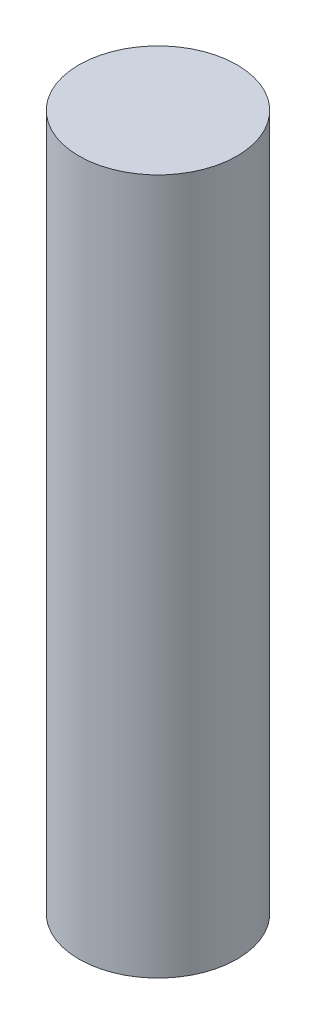
ISO-10303-21;
HEADER;
FILE_DESCRIPTION(('STEP AP214'),'2;1');
FILE_NAME('part.step','',(''),(''),'','','');
FILE_SCHEMA(('AUTOMOTIVE_DESIGN { 1 0 10303 214 1 1 1 1 }'));
ENDSEC;
DATA;
#1=APPLICATION_CONTEXT('core data for automotive mechanical design processes');
#2=APPLICATION_PROTOCOL_DEFINITION('international standard','automotive_design',2000,#1);
#3=PRODUCT_CONTEXT('',#1,'mechanical');
#4=PRODUCT('Part','Part','',(#3));
#5=PRODUCT_RELATED_PRODUCT_CATEGORY('part','',(#4));
#6=PRODUCT_DEFINITION_FORMATION('','',#4);
#7=PRODUCT_DEFINITION_CONTEXT('part definition',#1,'design');
#8=PRODUCT_DEFINITION('design','',#6,#7);
#9=PRODUCT_DEFINITION_SHAPE('','',#8);
#10=(LENGTH_UNIT() NAMED_UNIT(*) SI_UNIT(.MILLI.,.METRE.));
#11=(NAMED_UNIT(*) PLANE_ANGLE_UNIT() SI_UNIT($,.RADIAN.));
#12=(NAMED_UNIT(*) SI_UNIT($,.STERADIAN.) SOLID_ANGLE_UNIT());
#13=UNCERTAINTY_MEASURE_WITH_UNIT(LENGTH_MEASURE(1.E-05),#10,'distance_accuracy_value','');
#14=(GEOMETRIC_REPRESENTATION_CONTEXT(3) GLOBAL_UNCERTAINTY_ASSIGNED_CONTEXT((#13)) GLOBAL_UNIT_ASSIGNED_CONTEXT((#10,
#11,#12)) REPRESENTATION_CONTEXT('',''));
#15=CARTESIAN_POINT('',(0.,0.,0.));
#16=DIRECTION('',(0.,0.,1.));
#17=DIRECTION('',(1.,0.,0.));
#18=AXIS2_PLACEMENT_3D('',#15,#16,#17);
#19=CARTESIAN_POINT('',(0.,34.925,0.));
#20=DIRECTION('',(0.,-1.,0.));
#21=DIRECTION('',(0.,0.,-1.));
#22=AXIS2_PLACEMENT_3D('',#19,#20,#21);
#23=CYLINDRICAL_SURFACE('',#22,3.96875);
#24=CARTESIAN_POINT('',(0.,34.925,0.));
#25=DIRECTION('',(0.,1.,0.));
#26=DIRECTION('',(0.,0.,1.));
#27=AXIS2_PLACEMENT_3D('',#24,#25,#26);
#28=CIRCLE('',#27,3.96875);
#29=CARTESIAN_POINT('',(0.,34.925,3.96875));
#30=VERTEX_POINT('',#29);
#31=EDGE_CURVE('E11',#30,#30,#28,.T.);
#32=ORIENTED_EDGE('',*,*,#31,.F.);
#33=EDGE_LOOP('',(#32));
#34=FACE_BOUND('',#33,.T.);
#35=CARTESIAN_POINT('',(0.,0.,0.));
#36=DIRECTION('',(0.,1.,0.));
#37=DIRECTION('',(0.,0.,1.));
#38=AXIS2_PLACEMENT_3D('',#35,#36,#37);
#39=CIRCLE('',#38,3.96875);
#40=CARTESIAN_POINT('',(0.,0.,3.96875));
#41=VERTEX_POINT('',#40);
#42=EDGE_CURVE('E40',#41,#41,#39,.T.);
#43=ORIENTED_EDGE('',*,*,#42,.T.);
#44=EDGE_LOOP('',(#43));
#45=FACE_BOUND('',#44,.T.);
#46=ADVANCED_FACE('F37',(#34,#45),#23,.T.);
#47=CARTESIAN_POINT('',(0.,34.925,0.));
#48=DIRECTION('',(0.,1.,0.));
#49=DIRECTION('',(0.,0.,1.));
#50=AXIS2_PLACEMENT_3D('',#47,#48,#49);
#51=PLANE('',#50);
#52=ORIENTED_EDGE('',*,*,#31,.T.);
#53=EDGE_LOOP('',(#52));
#54=FACE_BOUND('',#53,.T.);
#55=ADVANCED_FACE('F66',(#54),#51,.T.);
#56=CARTESIAN_POINT('',(0.,0.,0.));
#57=DIRECTION('',(0.,1.,0.));
#58=DIRECTION('',(0.,0.,1.));
#59=AXIS2_PLACEMENT_3D('',#56,#57,#58);
#60=PLANE('',#59);
#61=CARTESIAN_POINT('',(0.,0.,0.));
#62=DIRECTION('',(0.,-1.,0.));
#63=DIRECTION('',(0.,0.,-1.));
#64=AXIS2_PLACEMENT_3D('',#61,#62,#63);
#65=CIRCLE('',#64,2.01929999999999);
#66=CARTESIAN_POINT('',(0.,0.,-2.01929999999999));
#67=VERTEX_POINT('',#66);
#68=EDGE_CURVE('E56',#67,#67,#65,.T.);
#69=ORIENTED_EDGE('',*,*,#68,.F.);
#70=EDGE_LOOP('',(#69));
#71=FACE_BOUND('',#70,.T.);
#72=ORIENTED_EDGE('',*,*,#42,.F.);
#73=EDGE_LOOP('',(#72));
#74=FACE_BOUND('',#73,.T.);
#75=ADVANCED_FACE('F50',(#71,#74),#60,.F.);
#76=CARTESIAN_POINT('',(0.,7.62,0.));
#77=DIRECTION('',(0.,-1.,0.));
#78=DIRECTION('',(0.,0.,-1.));
#79=AXIS2_PLACEMENT_3D('',#76,#77,#78);
#80=CONICAL_SURFACE('',#79,2.0193,1.02974425867665);
#81=CARTESIAN_POINT('',(0.,8.83331784800235,0.));
#82=VERTEX_POINT('',#81);
#83=VERTEX_LOOP('',#82);
#84=FACE_BOUND('',#83,.T.);
#85=CARTESIAN_POINT('',(0.,7.62,0.));
#86=DIRECTION('',(0.,-1.,0.));
#87=DIRECTION('',(0.,0.,-1.));
#88=AXIS2_PLACEMENT_3D('',#85,#86,#87);
#89=CIRCLE('',#88,2.0193);
#90=CARTESIAN_POINT('',(0.,7.62,-2.0193));
#91=VERTEX_POINT('',#90);
#92=EDGE_CURVE('E54',#91,#91,#89,.T.);
#93=ORIENTED_EDGE('',*,*,#92,.T.);
#94=EDGE_LOOP('',(#93));
#95=FACE_BOUND('',#94,.T.);
#96=ADVANCED_FACE('F46',(#84,#95),#80,.F.);
#97=CARTESIAN_POINT('',(0.,0.,0.));
#98=DIRECTION('',(0.,-1.,0.));
#99=DIRECTION('',(0.,0.,-1.));
#100=AXIS2_PLACEMENT_3D('',#97,#98,#99);
#101=CYLINDRICAL_SURFACE('',#100,2.01929999999999);
#102=ORIENTED_EDGE('',*,*,#92,.F.);
#103=EDGE_LOOP('',(#102));
#104=FACE_BOUND('',#103,.T.);
#105=ORIENTED_EDGE('',*,*,#68,.T.);
#106=EDGE_LOOP('',(#105));
#107=FACE_BOUND('',#106,.T.);
#108=ADVANCED_FACE('F49',(#104,#107),#101,.F.);
#109=CLOSED_SHELL('',(#46,#55,#75,#96,#108));
#110=MANIFOLD_SOLID_BREP('B2',#109);
#111=ADVANCED_BREP_SHAPE_REPRESENTATION('',(#18,#110),#14);
#112=SHAPE_DEFINITION_REPRESENTATION(#9,#111);
ENDSEC;
END-ISO-10303-21;
